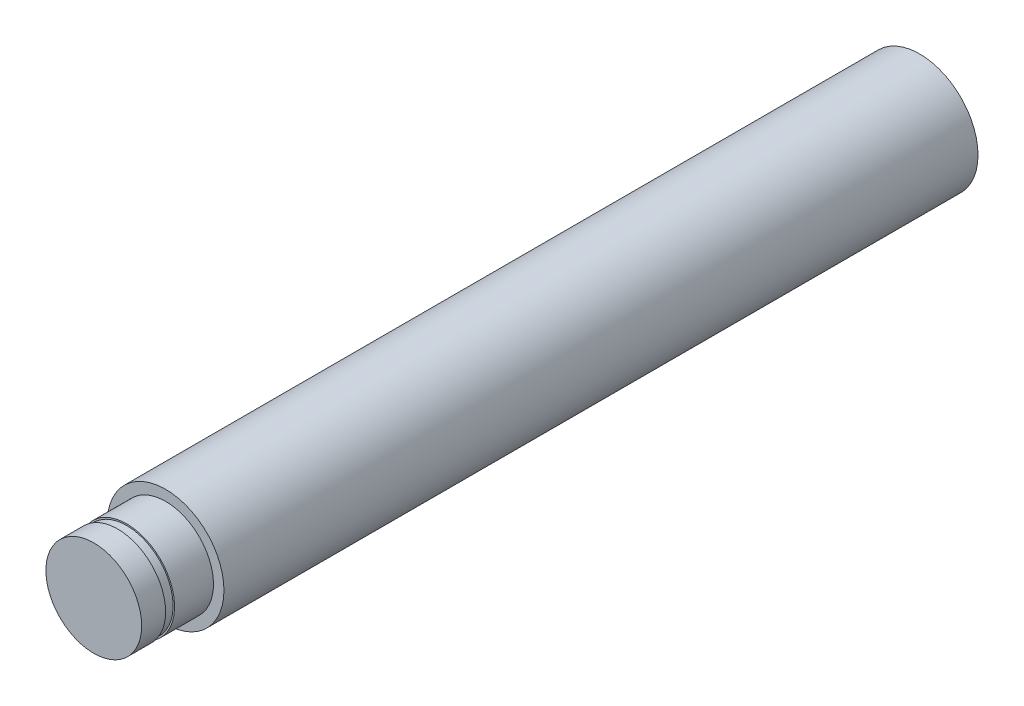
ISO-10303-21;
HEADER;
FILE_DESCRIPTION(('STEP AP214'),'2;1');
FILE_NAME('part.step','',(''),(''),'','','');
FILE_SCHEMA(('AUTOMOTIVE_DESIGN { 1 0 10303 214 1 1 1 1 }'));
ENDSEC;
DATA;
#1=APPLICATION_CONTEXT('core data for automotive mechanical design processes');
#2=APPLICATION_PROTOCOL_DEFINITION('international standard','automotive_design',2000,#1);
#3=PRODUCT_CONTEXT('',#1,'mechanical');
#4=PRODUCT('Part','Part','',(#3));
#5=PRODUCT_RELATED_PRODUCT_CATEGORY('part','',(#4));
#6=PRODUCT_DEFINITION_FORMATION('','',#4);
#7=PRODUCT_DEFINITION_CONTEXT('part definition',#1,'design');
#8=PRODUCT_DEFINITION('design','',#6,#7);
#9=PRODUCT_DEFINITION_SHAPE('','',#8);
#10=(LENGTH_UNIT() NAMED_UNIT(*) SI_UNIT(.MILLI.,.METRE.));
#11=(NAMED_UNIT(*) PLANE_ANGLE_UNIT() SI_UNIT($,.RADIAN.));
#12=(NAMED_UNIT(*) SI_UNIT($,.STERADIAN.) SOLID_ANGLE_UNIT());
#13=UNCERTAINTY_MEASURE_WITH_UNIT(LENGTH_MEASURE(1.E-05),#10,'distance_accuracy_value','');
#14=(GEOMETRIC_REPRESENTATION_CONTEXT(3) GLOBAL_UNCERTAINTY_ASSIGNED_CONTEXT((#13)) GLOBAL_UNIT_ASSIGNED_CONTEXT((#10,
#11,#12)) REPRESENTATION_CONTEXT('',''));
#15=CARTESIAN_POINT('',(0.,0.,0.));
#16=DIRECTION('',(0.,0.,1.));
#17=DIRECTION('',(1.,0.,0.));
#18=AXIS2_PLACEMENT_3D('',#15,#16,#17);
#19=CARTESIAN_POINT('',(0.,0.,33.655));
#20=DIRECTION('',(0.,0.,1.));
#21=DIRECTION('',(1.,0.,0.));
#22=AXIS2_PLACEMENT_3D('',#19,#20,#21);
#23=PLANE('',#22);
#24=CARTESIAN_POINT('',(0.,0.,33.655));
#25=DIRECTION('',(0.,0.,1.));
#26=DIRECTION('',(1.,0.,0.));
#27=AXIS2_PLACEMENT_3D('',#24,#25,#26);
#28=CIRCLE('',#27,2.032);
#29=CARTESIAN_POINT('',(-2.032,0.,33.655));
#30=VERTEX_POINT('',#29);
#31=EDGE_CURVE('E41',#30,#30,#28,.T.);
#32=ORIENTED_EDGE('',*,*,#31,.T.);
#33=EDGE_LOOP('',(#32));
#34=FACE_BOUND('',#33,.T.);
#35=CARTESIAN_POINT('',(0.,0.,33.655));
#36=DIRECTION('',(0.,0.,1.));
#37=DIRECTION('',(1.,0.,0.));
#38=AXIS2_PLACEMENT_3D('',#35,#36,#37);
#39=CIRCLE('',#38,1.9685);
#40=CARTESIAN_POINT('',(-1.9685,0.,33.655));
#41=VERTEX_POINT('',#40);
#42=EDGE_CURVE('E49',#41,#41,#39,.T.);
#43=ORIENTED_EDGE('',*,*,#42,.F.);
#44=EDGE_LOOP('',(#43));
#45=FACE_BOUND('',#44,.T.);
#46=ADVANCED_FACE('F30',(#34,#45),#23,.T.);
#47=CARTESIAN_POINT('',(0.,0.,32.004));
#48=DIRECTION('',(0.,0.,1.));
#49=DIRECTION('',(1.,0.,0.));
#50=AXIS2_PLACEMENT_3D('',#47,#48,#49);
#51=PLANE('',#50);
#52=CARTESIAN_POINT('',(0.,0.,32.004));
#53=DIRECTION('',(0.,0.,1.));
#54=DIRECTION('',(1.,0.,0.));
#55=AXIS2_PLACEMENT_3D('',#52,#53,#54);
#56=CIRCLE('',#55,2.4765);
#57=CARTESIAN_POINT('',(2.4765,0.,32.004));
#58=VERTEX_POINT('',#57);
#59=EDGE_CURVE('E10',#58,#58,#56,.T.);
#60=ORIENTED_EDGE('',*,*,#59,.T.);
#61=EDGE_LOOP('',(#60));
#62=FACE_BOUND('',#61,.T.);
#63=CARTESIAN_POINT('',(0.,0.,32.004));
#64=DIRECTION('',(0.,0.,1.));
#65=DIRECTION('',(1.,0.,0.));
#66=AXIS2_PLACEMENT_3D('',#63,#64,#65);
#67=CIRCLE('',#66,2.032);
#68=CARTESIAN_POINT('',(-2.032,0.,32.004));
#69=VERTEX_POINT('',#68);
#70=EDGE_CURVE('E43',#69,#69,#67,.T.);
#71=ORIENTED_EDGE('',*,*,#70,.F.);
#72=EDGE_LOOP('',(#71));
#73=FACE_BOUND('',#72,.T.);
#74=ADVANCED_FACE('F83',(#62,#73),#51,.T.);
#75=CARTESIAN_POINT('',(0.,0.,32.004));
#76=DIRECTION('',(0.,0.,-1.));
#77=DIRECTION('',(-1.,0.,0.));
#78=AXIS2_PLACEMENT_3D('',#75,#76,#77);
#79=CYLINDRICAL_SURFACE('',#78,2.4765);
#80=ORIENTED_EDGE('',*,*,#59,.F.);
#81=EDGE_LOOP('',(#80));
#82=FACE_BOUND('',#81,.T.);
#83=CARTESIAN_POINT('',(0.,0.,0.));
#84=DIRECTION('',(0.,0.,1.));
#85=DIRECTION('',(1.,0.,0.));
#86=AXIS2_PLACEMENT_3D('',#83,#84,#85);
#87=CIRCLE('',#86,2.4765);
#88=CARTESIAN_POINT('',(2.4765,0.,0.));
#89=VERTEX_POINT('',#88);
#90=EDGE_CURVE('E34',#89,#89,#87,.T.);
#91=ORIENTED_EDGE('',*,*,#90,.T.);
#92=EDGE_LOOP('',(#91));
#93=FACE_BOUND('',#92,.T.);
#94=ADVANCED_FACE('F32',(#82,#93),#79,.T.);
#95=CARTESIAN_POINT('',(0.,0.,0.));
#96=DIRECTION('',(0.,0.,1.));
#97=DIRECTION('',(1.,0.,0.));
#98=AXIS2_PLACEMENT_3D('',#95,#96,#97);
#99=PLANE('',#98);
#100=ORIENTED_EDGE('',*,*,#90,.F.);
#101=EDGE_LOOP('',(#100));
#102=FACE_BOUND('',#101,.T.);
#103=ADVANCED_FACE('F92',(#102),#99,.F.);
#104=CARTESIAN_POINT('',(0.,0.,33.655));
#105=DIRECTION('',(0.,0.,-1.));
#106=DIRECTION('',(-1.,0.,0.));
#107=AXIS2_PLACEMENT_3D('',#104,#105,#106);
#108=CYLINDRICAL_SURFACE('',#107,2.032);
#109=CARTESIAN_POINT('',(-2.032,0.,33.655));
#110=CARTESIAN_POINT('',(-2.032,0.,33.6378020833333));
#111=CARTESIAN_POINT('',(-2.032,0.,33.6206041666667));
#112=CARTESIAN_POINT('',(-2.032,0.,33.5862083333333));
#113=CARTESIAN_POINT('',(-2.032,0.,33.5690104166667));
#114=CARTESIAN_POINT('',(-2.032,0.,33.5346145833333));
#115=CARTESIAN_POINT('',(-2.032,0.,33.5174166666667));
#116=CARTESIAN_POINT('',(-2.032,0.,33.4830208333333));
#117=CARTESIAN_POINT('',(-2.032,0.,33.4658229166667));
#118=CARTESIAN_POINT('',(-2.032,0.,33.4314270833333));
#119=CARTESIAN_POINT('',(-2.032,0.,33.4142291666667));
#120=CARTESIAN_POINT('',(-2.032,0.,33.3798333333333));
#121=CARTESIAN_POINT('',(-2.032,0.,33.3626354166667));
#122=CARTESIAN_POINT('',(-2.032,0.,33.3282395833333));
#123=CARTESIAN_POINT('',(-2.032,0.,33.3110416666667));
#124=CARTESIAN_POINT('',(-2.032,0.,33.2766458333333));
#125=CARTESIAN_POINT('',(-2.032,0.,33.2594479166667));
#126=CARTESIAN_POINT('',(-2.032,0.,33.2250520833333));
#127=CARTESIAN_POINT('',(-2.032,0.,33.2078541666667));
#128=CARTESIAN_POINT('',(-2.032,0.,33.1734583333333));
#129=CARTESIAN_POINT('',(-2.032,0.,33.1562604166667));
#130=CARTESIAN_POINT('',(-2.032,0.,33.1218645833333));
#131=CARTESIAN_POINT('',(-2.032,0.,33.1046666666667));
#132=CARTESIAN_POINT('',(-2.032,0.,33.0702708333333));
#133=CARTESIAN_POINT('',(-2.032,0.,33.0530729166667));
#134=CARTESIAN_POINT('',(-2.032,0.,33.0186770833333));
#135=CARTESIAN_POINT('',(-2.032,0.,33.0014791666667));
#136=CARTESIAN_POINT('',(-2.032,0.,32.9670833333333));
#137=CARTESIAN_POINT('',(-2.032,0.,32.9498854166667));
#138=CARTESIAN_POINT('',(-2.032,0.,32.9154895833333));
#139=CARTESIAN_POINT('',(-2.032,0.,32.8982916666667));
#140=CARTESIAN_POINT('',(-2.032,0.,32.8638958333333));
#141=CARTESIAN_POINT('',(-2.032,0.,32.8466979166667));
#142=CARTESIAN_POINT('',(-2.032,0.,32.8123020833333));
#143=CARTESIAN_POINT('',(-2.032,0.,32.7951041666667));
#144=CARTESIAN_POINT('',(-2.032,0.,32.7607083333333));
#145=CARTESIAN_POINT('',(-2.032,0.,32.7435104166667));
#146=CARTESIAN_POINT('',(-2.032,0.,32.7091145833333));
#147=CARTESIAN_POINT('',(-2.032,0.,32.6919166666667));
#148=CARTESIAN_POINT('',(-2.032,0.,32.6575208333333));
#149=CARTESIAN_POINT('',(-2.032,0.,32.6403229166667));
#150=CARTESIAN_POINT('',(-2.032,0.,32.6059270833333));
#151=CARTESIAN_POINT('',(-2.032,0.,32.5887291666667));
#152=CARTESIAN_POINT('',(-2.032,0.,32.5543333333333));
#153=CARTESIAN_POINT('',(-2.032,0.,32.5371354166667));
#154=CARTESIAN_POINT('',(-2.032,0.,32.5027395833333));
#155=CARTESIAN_POINT('',(-2.032,0.,32.4855416666667));
#156=CARTESIAN_POINT('',(-2.032,0.,32.4511458333333));
#157=CARTESIAN_POINT('',(-2.032,0.,32.4339479166667));
#158=CARTESIAN_POINT('',(-2.032,0.,32.3995520833333));
#159=CARTESIAN_POINT('',(-2.032,0.,32.3823541666667));
#160=CARTESIAN_POINT('',(-2.032,0.,32.3479583333333));
#161=CARTESIAN_POINT('',(-2.032,0.,32.3307604166667));
#162=CARTESIAN_POINT('',(-2.032,0.,32.2963645833333));
#163=CARTESIAN_POINT('',(-2.032,0.,32.2791666666667));
#164=CARTESIAN_POINT('',(-2.032,0.,32.2447708333333));
#165=CARTESIAN_POINT('',(-2.032,0.,32.2275729166667));
#166=CARTESIAN_POINT('',(-2.032,0.,32.1931770833333));
#167=CARTESIAN_POINT('',(-2.032,0.,32.1759791666667));
#168=CARTESIAN_POINT('',(-2.032,0.,32.1415833333333));
#169=CARTESIAN_POINT('',(-2.032,0.,32.1243854166667));
#170=CARTESIAN_POINT('',(-2.032,0.,32.0899895833333));
#171=CARTESIAN_POINT('',(-2.032,0.,32.0727916666667));
#172=CARTESIAN_POINT('',(-2.032,0.,32.0383958333333));
#173=CARTESIAN_POINT('',(-2.032,0.,32.0211979166667));
#174=CARTESIAN_POINT('',(-2.032,0.,32.004));
#175=B_SPLINE_CURVE_WITH_KNOTS('',3,(#109,#110,#111,#112,#113,#114,#115,#116,#117,#118,#119,
#120,#121,#122,#123,#124,#125,#126,#127,#128,#129,#130,#131,#132,#133,#134,#135,#136,#137,#138,
#139,#140,#141,#142,#143,#144,#145,#146,#147,#148,#149,#150,#151,#152,#153,#154,#155,#156,#157,
#158,#159,#160,#161,#162,#163,#164,#165,#166,#167,#168,#169,#170,#171,#172,#173,#174),
.UNSPECIFIED.,.F.,.F.,(4,2,2,2,2,2,2,2,2,2,2,2,2,2,2,2,2,2,2,2,2,2,2,2,2,2,2,2,2,2,2,2,4),(0.,
0.0515937500000022,0.103187500000004,0.154781250000006,0.206375000000002,0.257968750000004,
0.309562500000006,0.361156250000001,0.412750000000003,0.464343750000006,0.515937500000001,
0.567531250000003,0.619125000000005,0.67071875,0.722312500000002,0.773906250000005,0.8255,
0.877093750000002,0.928687500000004,0.980281250000006,1.031875,1.08346875,1.13506250000001,
1.18665625,1.23825,1.28984375000001,1.3414375,1.39303125,1.444625,1.49621875,1.5478125,
1.59940625,1.651),.UNSPECIFIED.);
#176=EDGE_CURVE('BSEAM78',#30,#69,#175,.T.);
#177=ORIENTED_EDGE('',*,*,#31,.F.);
#178=ORIENTED_EDGE('',*,*,#70,.T.);
#179=ORIENTED_EDGE('',*,*,#176,.T.);
#180=ORIENTED_EDGE('',*,*,#176,.F.);
#181=EDGE_LOOP('',(#177,#179,#178,#180));
#182=FACE_BOUND('',#181,.T.);
#183=ADVANCED_FACE('F78',(#182),#108,.T.);
#184=CARTESIAN_POINT('',(0.,0.,34.036));
#185=DIRECTION('',(0.,0.,-1.));
#186=DIRECTION('',(-1.,0.,0.));
#187=AXIS2_PLACEMENT_3D('',#184,#185,#186);
#188=CYLINDRICAL_SURFACE('',#187,1.9685);
#189=CARTESIAN_POINT('',(0.,0.,34.036));
#190=DIRECTION('',(0.,0.,1.));
#191=DIRECTION('',(1.,0.,0.));
#192=AXIS2_PLACEMENT_3D('',#189,#190,#191);
#193=CIRCLE('',#192,1.9685);
#194=CARTESIAN_POINT('',(-1.9685,0.,34.036));
#195=VERTEX_POINT('',#194);
#196=EDGE_CURVE('E46',#195,#195,#193,.T.);
#197=CARTESIAN_POINT('',(-1.9685,0.,34.036));
#198=CARTESIAN_POINT('',(-1.9685,0.,34.03203125));
#199=CARTESIAN_POINT('',(-1.9685,0.,34.0280625));
#200=CARTESIAN_POINT('',(-1.9685,0.,34.020125));
#201=CARTESIAN_POINT('',(-1.9685,0.,34.01615625));
#202=CARTESIAN_POINT('',(-1.9685,0.,34.00821875));
#203=CARTESIAN_POINT('',(-1.9685,0.,34.00425));
#204=CARTESIAN_POINT('',(-1.9685,0.,33.9963125));
#205=CARTESIAN_POINT('',(-1.9685,0.,33.99234375));
#206=CARTESIAN_POINT('',(-1.9685,0.,33.98440625));
#207=CARTESIAN_POINT('',(-1.9685,0.,33.9804375));
#208=CARTESIAN_POINT('',(-1.9685,0.,33.9725));
#209=CARTESIAN_POINT('',(-1.9685,0.,33.96853125));
#210=CARTESIAN_POINT('',(-1.9685,0.,33.96059375));
#211=CARTESIAN_POINT('',(-1.9685,0.,33.956625));
#212=CARTESIAN_POINT('',(-1.9685,0.,33.9486875));
#213=CARTESIAN_POINT('',(-1.9685,0.,33.94471875));
#214=CARTESIAN_POINT('',(-1.9685,0.,33.93678125));
#215=CARTESIAN_POINT('',(-1.9685,0.,33.9328125));
#216=CARTESIAN_POINT('',(-1.9685,0.,33.924875));
#217=CARTESIAN_POINT('',(-1.9685,0.,33.92090625));
#218=CARTESIAN_POINT('',(-1.9685,0.,33.91296875));
#219=CARTESIAN_POINT('',(-1.9685,0.,33.909));
#220=CARTESIAN_POINT('',(-1.9685,0.,33.9010625));
#221=CARTESIAN_POINT('',(-1.9685,0.,33.89709375));
#222=CARTESIAN_POINT('',(-1.9685,0.,33.88915625));
#223=CARTESIAN_POINT('',(-1.9685,0.,33.8851875));
#224=CARTESIAN_POINT('',(-1.9685,0.,33.87725));
#225=CARTESIAN_POINT('',(-1.9685,0.,33.87328125));
#226=CARTESIAN_POINT('',(-1.9685,0.,33.86534375));
#227=CARTESIAN_POINT('',(-1.9685,0.,33.861375));
#228=CARTESIAN_POINT('',(-1.9685,0.,33.8534375));
#229=CARTESIAN_POINT('',(-1.9685,0.,33.84946875));
#230=CARTESIAN_POINT('',(-1.9685,0.,33.84153125));
#231=CARTESIAN_POINT('',(-1.9685,0.,33.8375625));
#232=CARTESIAN_POINT('',(-1.9685,0.,33.829625));
#233=CARTESIAN_POINT('',(-1.9685,0.,33.82565625));
#234=CARTESIAN_POINT('',(-1.9685,0.,33.81771875));
#235=CARTESIAN_POINT('',(-1.9685,0.,33.81375));
#236=CARTESIAN_POINT('',(-1.9685,0.,33.8058125));
#237=CARTESIAN_POINT('',(-1.9685,0.,33.80184375));
#238=CARTESIAN_POINT('',(-1.9685,0.,33.79390625));
#239=CARTESIAN_POINT('',(-1.9685,0.,33.7899375));
#240=CARTESIAN_POINT('',(-1.9685,0.,33.782));
#241=CARTESIAN_POINT('',(-1.9685,0.,33.77803125));
#242=CARTESIAN_POINT('',(-1.9685,0.,33.77009375));
#243=CARTESIAN_POINT('',(-1.9685,0.,33.766125));
#244=CARTESIAN_POINT('',(-1.9685,0.,33.7581875));
#245=CARTESIAN_POINT('',(-1.9685,0.,33.75421875));
#246=CARTESIAN_POINT('',(-1.9685,0.,33.74628125));
#247=CARTESIAN_POINT('',(-1.9685,0.,33.7423125));
#248=CARTESIAN_POINT('',(-1.9685,0.,33.734375));
#249=CARTESIAN_POINT('',(-1.9685,0.,33.73040625));
#250=CARTESIAN_POINT('',(-1.9685,0.,33.72246875));
#251=CARTESIAN_POINT('',(-1.9685,0.,33.7185));
#252=CARTESIAN_POINT('',(-1.9685,0.,33.7105625));
#253=CARTESIAN_POINT('',(-1.9685,0.,33.70659375));
#254=CARTESIAN_POINT('',(-1.9685,0.,33.69865625));
#255=CARTESIAN_POINT('',(-1.9685,0.,33.6946875));
#256=CARTESIAN_POINT('',(-1.9685,0.,33.68675));
#257=CARTESIAN_POINT('',(-1.9685,0.,33.68278125));
#258=CARTESIAN_POINT('',(-1.9685,0.,33.67484375));
#259=CARTESIAN_POINT('',(-1.9685,0.,33.670875));
#260=CARTESIAN_POINT('',(-1.9685,0.,33.6629375));
#261=CARTESIAN_POINT('',(-1.9685,0.,33.65896875));
#262=CARTESIAN_POINT('',(-1.9685,0.,33.655));
#263=B_SPLINE_CURVE_WITH_KNOTS('',3,(#197,#198,#199,#200,#201,#202,#203,#204,#205,#206,#207,
#208,#209,#210,#211,#212,#213,#214,#215,#216,#217,#218,#219,#220,#221,#222,#223,#224,#225,#226,
#227,#228,#229,#230,#231,#232,#233,#234,#235,#236,#237,#238,#239,#240,#241,#242,#243,#244,#245,
#246,#247,#248,#249,#250,#251,#252,#253,#254,#255,#256,#257,#258,#259,#260,#261,#262),
.UNSPECIFIED.,.F.,.F.,(4,2,2,2,2,2,2,2,2,2,2,2,2,2,2,2,2,2,2,2,2,2,2,2,2,2,2,2,2,2,2,2,4),(0.,
0.0119062500000058,0.0238125000000047,0.0357187500000036,0.0476250000000025,0.0595312500000014,
0.0714375000000003,0.0833437500000062,0.0952500000000051,0.107156250000004,0.119062500000003,
0.130968750000002,0.142875000000001,0.154781250000006,0.166687500000005,0.178593750000004,
0.190500000000003,0.202406250000002,0.214312500000001,0.22621875,0.238125000000006,
0.250031250000005,0.261937500000003,0.273843750000002,0.285750000000001,0.29765625,
0.309562500000006,0.321468750000005,0.333375000000004,0.345281250000003,0.357187500000002,
0.36909375,0.380999999999999),.UNSPECIFIED.);
#264=EDGE_CURVE('BSEAM72',#195,#41,#263,.T.);
#265=ORIENTED_EDGE('',*,*,#196,.F.);
#266=ORIENTED_EDGE('',*,*,#42,.T.);
#267=ORIENTED_EDGE('',*,*,#264,.T.);
#268=ORIENTED_EDGE('',*,*,#264,.F.);
#269=EDGE_LOOP('',(#265,#267,#266,#268));
#270=FACE_BOUND('',#269,.T.);
#271=ADVANCED_FACE('F72',(#270),#188,.T.);
#272=CARTESIAN_POINT('',(0.,0.,34.036));
#273=DIRECTION('',(0.,0.,1.));
#274=DIRECTION('',(1.,0.,0.));
#275=AXIS2_PLACEMENT_3D('',#272,#273,#274);
#276=PLANE('',#275);
#277=CARTESIAN_POINT('',(0.,0.,34.036));
#278=DIRECTION('',(0.,0.,1.));
#279=DIRECTION('',(1.,0.,0.));
#280=AXIS2_PLACEMENT_3D('',#277,#278,#279);
#281=CIRCLE('',#280,2.032);
#282=CARTESIAN_POINT('',(2.032,0.,34.036));
#283=VERTEX_POINT('',#282);
#284=EDGE_CURVE('E55',#283,#283,#281,.T.);
#285=ORIENTED_EDGE('',*,*,#284,.F.);
#286=EDGE_LOOP('',(#285));
#287=FACE_BOUND('',#286,.T.);
#288=ORIENTED_EDGE('',*,*,#196,.T.);
#289=EDGE_LOOP('',(#288));
#290=FACE_BOUND('',#289,.T.);
#291=ADVANCED_FACE('F66',(#287,#290),#276,.F.);
#292=CARTESIAN_POINT('',(0.,0.,35.052));
#293=DIRECTION('',(0.,0.,-1.));
#294=DIRECTION('',(-1.,0.,0.));
#295=AXIS2_PLACEMENT_3D('',#292,#293,#294);
#296=CYLINDRICAL_SURFACE('',#295,2.032);
#297=CARTESIAN_POINT('',(0.,0.,35.052));
#298=DIRECTION('',(0.,0.,1.));
#299=DIRECTION('',(1.,0.,0.));
#300=AXIS2_PLACEMENT_3D('',#297,#298,#299);
#301=CIRCLE('',#300,2.032);
#302=CARTESIAN_POINT('',(2.032,0.,35.052));
#303=VERTEX_POINT('',#302);
#304=EDGE_CURVE('E52',#303,#303,#301,.T.);
#305=ORIENTED_EDGE('',*,*,#304,.F.);
#306=EDGE_LOOP('',(#305));
#307=FACE_BOUND('',#306,.T.);
#308=ORIENTED_EDGE('',*,*,#284,.T.);
#309=EDGE_LOOP('',(#308));
#310=FACE_BOUND('',#309,.T.);
#311=ADVANCED_FACE('F63',(#307,#310),#296,.T.);
#312=CARTESIAN_POINT('',(0.,0.,35.052));
#313=DIRECTION('',(0.,0.,1.));
#314=DIRECTION('',(1.,0.,0.));
#315=AXIS2_PLACEMENT_3D('',#312,#313,#314);
#316=PLANE('',#315);
#317=ORIENTED_EDGE('',*,*,#304,.T.);
#318=EDGE_LOOP('',(#317));
#319=FACE_BOUND('',#318,.T.);
#320=ADVANCED_FACE('F61',(#319),#316,.T.);
#321=CLOSED_SHELL('',(#46,#74,#94,#103,#183,#271,#291,#311,#320));
#322=MANIFOLD_SOLID_BREP('B2',#321);
#323=ADVANCED_BREP_SHAPE_REPRESENTATION('',(#18,#322),#14);
#324=SHAPE_DEFINITION_REPRESENTATION(#9,#323);
ENDSEC;
END-ISO-10303-21;
